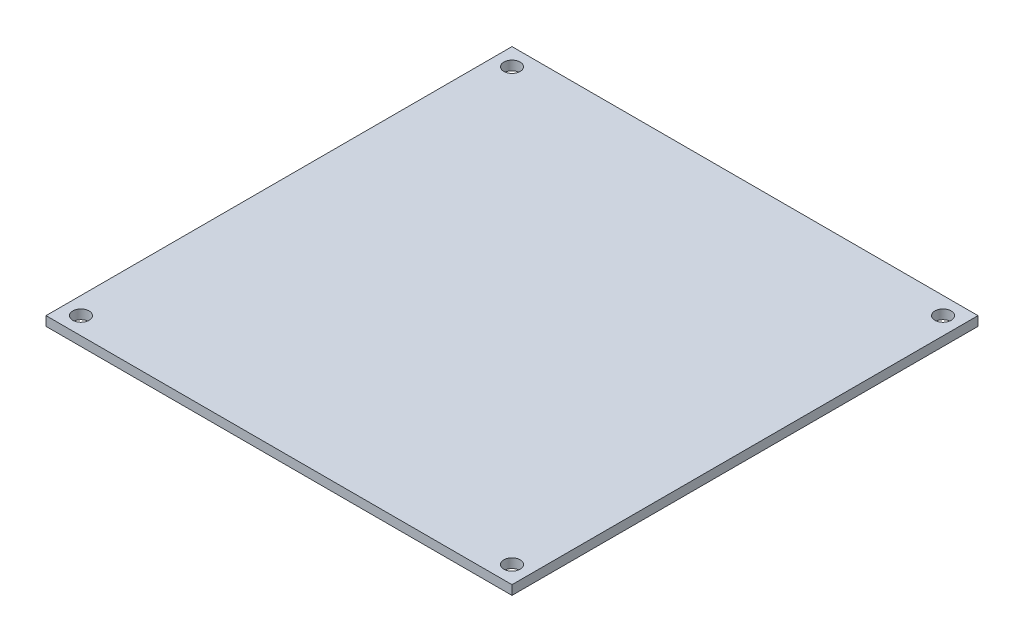
ISO-10303-21;
HEADER;
FILE_DESCRIPTION(('STEP AP214'),'2;1');
FILE_NAME('part.step','',(''),(''),'','','');
FILE_SCHEMA(('AUTOMOTIVE_DESIGN { 1 0 10303 214 1 1 1 1 }'));
ENDSEC;
DATA;
#1=APPLICATION_CONTEXT('core data for automotive mechanical design processes');
#2=APPLICATION_PROTOCOL_DEFINITION('international standard','automotive_design',2000,#1);
#3=PRODUCT_CONTEXT('',#1,'mechanical');
#4=PRODUCT('Part','Part','',(#3));
#5=PRODUCT_RELATED_PRODUCT_CATEGORY('part','',(#4));
#6=PRODUCT_DEFINITION_FORMATION('','',#4);
#7=PRODUCT_DEFINITION_CONTEXT('part definition',#1,'design');
#8=PRODUCT_DEFINITION('design','',#6,#7);
#9=PRODUCT_DEFINITION_SHAPE('','',#8);
#10=(LENGTH_UNIT() NAMED_UNIT(*) SI_UNIT(.MILLI.,.METRE.));
#11=(NAMED_UNIT(*) PLANE_ANGLE_UNIT() SI_UNIT($,.RADIAN.));
#12=(NAMED_UNIT(*) SI_UNIT($,.STERADIAN.) SOLID_ANGLE_UNIT());
#13=UNCERTAINTY_MEASURE_WITH_UNIT(LENGTH_MEASURE(1.E-05),#10,'distance_accuracy_value','');
#14=(GEOMETRIC_REPRESENTATION_CONTEXT(3) GLOBAL_UNCERTAINTY_ASSIGNED_CONTEXT((#13)) GLOBAL_UNIT_ASSIGNED_CONTEXT((#10,
#11,#12)) REPRESENTATION_CONTEXT('',''));
#15=CARTESIAN_POINT('',(0.,0.,0.));
#16=DIRECTION('',(0.,0.,1.));
#17=DIRECTION('',(1.,0.,0.));
#18=AXIS2_PLACEMENT_3D('',#15,#16,#17);
#19=CARTESIAN_POINT('',(0.,2.,0.));
#20=DIRECTION('',(0.,1.,0.));
#21=DIRECTION('',(0.,0.,1.));
#22=AXIS2_PLACEMENT_3D('',#19,#20,#21);
#23=PLANE('',#22);
#24=CARTESIAN_POINT('',(46.25,2.,46.25));
#25=DIRECTION('',(0.,1.,0.));
#26=DIRECTION('',(0.,0.,1.));
#27=AXIS2_PLACEMENT_3D('',#24,#25,#26);
#28=CIRCLE('',#27,1.75);
#29=CARTESIAN_POINT('',(46.25,2.,48.));
#30=VERTEX_POINT('',#29);
#31=EDGE_CURVE('E120',#30,#30,#28,.T.);
#32=ORIENTED_EDGE('',*,*,#31,.F.);
#33=EDGE_LOOP('',(#32));
#34=FACE_BOUND('',#33,.T.);
#35=CARTESIAN_POINT('',(-46.25,2.,-46.25));
#36=DIRECTION('',(0.,1.,0.));
#37=DIRECTION('',(0.,0.,1.));
#38=AXIS2_PLACEMENT_3D('',#35,#36,#37);
#39=CIRCLE('',#38,1.75);
#40=CARTESIAN_POINT('',(-46.25,2.,-44.5));
#41=VERTEX_POINT('',#40);
#42=EDGE_CURVE('E99',#41,#41,#39,.T.);
#43=ORIENTED_EDGE('',*,*,#42,.F.);
#44=EDGE_LOOP('',(#43));
#45=FACE_BOUND('',#44,.T.);
#46=DIRECTION('',(0.,0.,1.));
#47=VECTOR('',#46,1.);
#48=CARTESIAN_POINT('',(-50.,2.,50.));
#49=LINE('',#48,#47);
#50=CARTESIAN_POINT('',(-50.,2.,-50.));
#51=VERTEX_POINT('',#50);
#52=CARTESIAN_POINT('',(-50.,2.,50.));
#53=VERTEX_POINT('',#52);
#54=EDGE_CURVE('E84',#51,#53,#49,.T.);
#55=ORIENTED_EDGE('',*,*,#54,.T.);
#56=DIRECTION('',(1.,0.,0.));
#57=VECTOR('',#56,1.);
#58=CARTESIAN_POINT('',(50.,2.,50.));
#59=LINE('',#58,#57);
#60=CARTESIAN_POINT('',(50.,2.,50.));
#61=VERTEX_POINT('',#60);
#62=EDGE_CURVE('E79',#53,#61,#59,.T.);
#63=ORIENTED_EDGE('',*,*,#62,.T.);
#64=DIRECTION('',(0.,0.,-1.));
#65=VECTOR('',#64,1.);
#66=CARTESIAN_POINT('',(50.,2.,50.));
#67=LINE('',#66,#65);
#68=CARTESIAN_POINT('',(50.,2.,-50.));
#69=VERTEX_POINT('',#68);
#70=EDGE_CURVE('E82',#61,#69,#67,.T.);
#71=ORIENTED_EDGE('',*,*,#70,.T.);
#72=DIRECTION('',(-1.,0.,0.));
#73=VECTOR('',#72,1.);
#74=CARTESIAN_POINT('',(50.,2.,-50.));
#75=LINE('',#74,#73);
#76=EDGE_CURVE('E49',#69,#51,#75,.T.);
#77=ORIENTED_EDGE('',*,*,#76,.T.);
#78=EDGE_LOOP('',(#55,#63,#71,#77));
#79=FACE_BOUND('',#78,.T.);
#80=CARTESIAN_POINT('',(46.25,2.,-46.25));
#81=DIRECTION('',(0.,1.,0.));
#82=DIRECTION('',(0.,0.,-1.));
#83=AXIS2_PLACEMENT_3D('',#80,#81,#82);
#84=CIRCLE('',#83,1.75);
#85=CARTESIAN_POINT('',(46.25,2.,-48.));
#86=VERTEX_POINT('',#85);
#87=EDGE_CURVE('E114',#86,#86,#84,.T.);
#88=ORIENTED_EDGE('',*,*,#87,.F.);
#89=EDGE_LOOP('',(#88));
#90=FACE_BOUND('',#89,.T.);
#91=CARTESIAN_POINT('',(-46.25,2.,46.25));
#92=DIRECTION('',(0.,1.,0.));
#93=DIRECTION('',(0.,0.,-1.));
#94=AXIS2_PLACEMENT_3D('',#91,#92,#93);
#95=CIRCLE('',#94,1.75);
#96=CARTESIAN_POINT('',(-46.25,2.,44.5));
#97=VERTEX_POINT('',#96);
#98=EDGE_CURVE('E126',#97,#97,#95,.T.);
#99=ORIENTED_EDGE('',*,*,#98,.F.);
#100=EDGE_LOOP('',(#99));
#101=FACE_BOUND('',#100,.T.);
#102=ADVANCED_FACE('F32',(#34,#45,#79,#90,#101),#23,.T.);
#103=CARTESIAN_POINT('',(0.,0.,0.));
#104=DIRECTION('',(0.,1.,0.));
#105=DIRECTION('',(0.,0.,1.));
#106=AXIS2_PLACEMENT_3D('',#103,#104,#105);
#107=PLANE('',#106);
#108=DIRECTION('',(0.,0.,1.));
#109=VECTOR('',#108,1.);
#110=CARTESIAN_POINT('',(-50.,0.,50.));
#111=LINE('',#110,#109);
#112=CARTESIAN_POINT('',(-50.,0.,-50.));
#113=VERTEX_POINT('',#112);
#114=CARTESIAN_POINT('',(-50.,0.,50.));
#115=VERTEX_POINT('',#114);
#116=EDGE_CURVE('E96',#113,#115,#111,.T.);
#117=ORIENTED_EDGE('',*,*,#116,.F.);
#118=DIRECTION('',(-1.,0.,0.));
#119=VECTOR('',#118,1.);
#120=CARTESIAN_POINT('',(50.,0.,-50.));
#121=LINE('',#120,#119);
#122=CARTESIAN_POINT('',(50.,0.,-50.));
#123=VERTEX_POINT('',#122);
#124=EDGE_CURVE('E72',#123,#113,#121,.T.);
#125=ORIENTED_EDGE('',*,*,#124,.F.);
#126=DIRECTION('',(0.,0.,-1.));
#127=VECTOR('',#126,1.);
#128=CARTESIAN_POINT('',(50.,0.,50.));
#129=LINE('',#128,#127);
#130=CARTESIAN_POINT('',(50.,0.,50.));
#131=VERTEX_POINT('',#130);
#132=EDGE_CURVE('E66',#131,#123,#129,.T.);
#133=ORIENTED_EDGE('',*,*,#132,.F.);
#134=DIRECTION('',(1.,0.,0.));
#135=VECTOR('',#134,1.);
#136=CARTESIAN_POINT('',(50.,0.,50.));
#137=LINE('',#136,#135);
#138=EDGE_CURVE('E88',#115,#131,#137,.T.);
#139=ORIENTED_EDGE('',*,*,#138,.F.);
#140=EDGE_LOOP('',(#117,#125,#133,#139));
#141=FACE_BOUND('',#140,.T.);
#142=CARTESIAN_POINT('',(-46.25,0.,-46.25));
#143=DIRECTION('',(0.,1.,0.));
#144=DIRECTION('',(0.,0.,1.));
#145=AXIS2_PLACEMENT_3D('',#142,#143,#144);
#146=CIRCLE('',#145,1.75);
#147=CARTESIAN_POINT('',(-46.25,0.,-44.5));
#148=VERTEX_POINT('',#147);
#149=EDGE_CURVE('E111',#148,#148,#146,.T.);
#150=ORIENTED_EDGE('',*,*,#149,.T.);
#151=EDGE_LOOP('',(#150));
#152=FACE_BOUND('',#151,.T.);
#153=CARTESIAN_POINT('',(46.25,0.,-46.25));
#154=DIRECTION('',(0.,1.,0.));
#155=DIRECTION('',(0.,0.,-1.));
#156=AXIS2_PLACEMENT_3D('',#153,#154,#155);
#157=CIRCLE('',#156,1.75);
#158=CARTESIAN_POINT('',(46.25,0.,-48.));
#159=VERTEX_POINT('',#158);
#160=EDGE_CURVE('E117',#159,#159,#157,.T.);
#161=ORIENTED_EDGE('',*,*,#160,.T.);
#162=EDGE_LOOP('',(#161));
#163=FACE_BOUND('',#162,.T.);
#164=CARTESIAN_POINT('',(46.25,0.,46.25));
#165=DIRECTION('',(0.,1.,0.));
#166=DIRECTION('',(0.,0.,1.));
#167=AXIS2_PLACEMENT_3D('',#164,#165,#166);
#168=CIRCLE('',#167,1.75);
#169=CARTESIAN_POINT('',(46.25,0.,48.));
#170=VERTEX_POINT('',#169);
#171=EDGE_CURVE('E123',#170,#170,#168,.T.);
#172=ORIENTED_EDGE('',*,*,#171,.T.);
#173=EDGE_LOOP('',(#172));
#174=FACE_BOUND('',#173,.T.);
#175=CARTESIAN_POINT('',(-46.25,0.,46.25));
#176=DIRECTION('',(0.,1.,0.));
#177=DIRECTION('',(0.,0.,-1.));
#178=AXIS2_PLACEMENT_3D('',#175,#176,#177);
#179=CIRCLE('',#178,1.75);
#180=CARTESIAN_POINT('',(-46.25,0.,44.5));
#181=VERTEX_POINT('',#180);
#182=EDGE_CURVE('E129',#181,#181,#179,.T.);
#183=ORIENTED_EDGE('',*,*,#182,.T.);
#184=EDGE_LOOP('',(#183));
#185=FACE_BOUND('',#184,.T.);
#186=ADVANCED_FACE('F107',(#141,#152,#163,#174,#185),#107,.F.);
#187=CARTESIAN_POINT('',(-50.,2.,50.));
#188=DIRECTION('',(1.,0.,0.));
#189=DIRECTION('',(0.,0.,-1.));
#190=AXIS2_PLACEMENT_3D('',#187,#188,#189);
#191=PLANE('',#190);
#192=ORIENTED_EDGE('',*,*,#116,.T.);
#193=DIRECTION('',(0.,-1.,0.));
#194=VECTOR('',#193,1.);
#195=CARTESIAN_POINT('',(-50.,2.,50.));
#196=LINE('',#195,#194);
#197=EDGE_CURVE('E11',#53,#115,#196,.T.);
#198=ORIENTED_EDGE('',*,*,#197,.F.);
#199=ORIENTED_EDGE('',*,*,#54,.F.);
#200=DIRECTION('',(0.,-1.,0.));
#201=VECTOR('',#200,1.);
#202=CARTESIAN_POINT('',(-50.,2.,-50.));
#203=LINE('',#202,#201);
#204=EDGE_CURVE('E92',#51,#113,#203,.T.);
#205=ORIENTED_EDGE('',*,*,#204,.T.);
#206=EDGE_LOOP('',(#192,#198,#199,#205));
#207=FACE_BOUND('',#206,.T.);
#208=ADVANCED_FACE('F34',(#207),#191,.F.);
#209=CARTESIAN_POINT('',(50.,2.,50.));
#210=DIRECTION('',(0.,0.,-1.));
#211=DIRECTION('',(-1.,0.,0.));
#212=AXIS2_PLACEMENT_3D('',#209,#210,#211);
#213=PLANE('',#212);
#214=ORIENTED_EDGE('',*,*,#138,.T.);
#215=DIRECTION('',(0.,-1.,0.));
#216=VECTOR('',#215,1.);
#217=CARTESIAN_POINT('',(50.,2.,50.));
#218=LINE('',#217,#216);
#219=EDGE_CURVE('E41',#61,#131,#218,.T.);
#220=ORIENTED_EDGE('',*,*,#219,.F.);
#221=ORIENTED_EDGE('',*,*,#62,.F.);
#222=ORIENTED_EDGE('',*,*,#197,.T.);
#223=EDGE_LOOP('',(#214,#220,#221,#222));
#224=FACE_BOUND('',#223,.T.);
#225=ADVANCED_FACE('F87',(#224),#213,.F.);
#226=CARTESIAN_POINT('',(50.,2.,50.));
#227=DIRECTION('',(-1.,0.,0.));
#228=DIRECTION('',(0.,0.,1.));
#229=AXIS2_PLACEMENT_3D('',#226,#227,#228);
#230=PLANE('',#229);
#231=ORIENTED_EDGE('',*,*,#132,.T.);
#232=DIRECTION('',(0.,-1.,0.));
#233=VECTOR('',#232,1.);
#234=CARTESIAN_POINT('',(50.,2.,-50.));
#235=LINE('',#234,#233);
#236=EDGE_CURVE('E89',#69,#123,#235,.T.);
#237=ORIENTED_EDGE('',*,*,#236,.F.);
#238=ORIENTED_EDGE('',*,*,#70,.F.);
#239=ORIENTED_EDGE('',*,*,#219,.T.);
#240=EDGE_LOOP('',(#231,#237,#238,#239));
#241=FACE_BOUND('',#240,.T.);
#242=ADVANCED_FACE('F90',(#241),#230,.F.);
#243=CARTESIAN_POINT('',(50.,2.,-50.));
#244=DIRECTION('',(0.,0.,1.));
#245=DIRECTION('',(1.,0.,0.));
#246=AXIS2_PLACEMENT_3D('',#243,#244,#245);
#247=PLANE('',#246);
#248=ORIENTED_EDGE('',*,*,#124,.T.);
#249=ORIENTED_EDGE('',*,*,#204,.F.);
#250=ORIENTED_EDGE('',*,*,#76,.F.);
#251=ORIENTED_EDGE('',*,*,#236,.T.);
#252=EDGE_LOOP('',(#248,#249,#250,#251));
#253=FACE_BOUND('',#252,.T.);
#254=ADVANCED_FACE('F104',(#253),#247,.F.);
#255=CARTESIAN_POINT('',(-46.25,2.,-46.25));
#256=DIRECTION('',(0.,-1.,0.));
#257=DIRECTION('',(0.,0.,-1.));
#258=AXIS2_PLACEMENT_3D('',#255,#256,#257);
#259=CYLINDRICAL_SURFACE('',#258,1.75);
#260=ORIENTED_EDGE('',*,*,#42,.T.);
#261=EDGE_LOOP('',(#260));
#262=FACE_BOUND('',#261,.T.);
#263=ORIENTED_EDGE('',*,*,#149,.F.);
#264=EDGE_LOOP('',(#263));
#265=FACE_BOUND('',#264,.T.);
#266=ADVANCED_FACE('F148',(#262,#265),#259,.F.);
#267=CARTESIAN_POINT('',(46.25,2.,-46.25));
#268=DIRECTION('',(0.,-1.,0.));
#269=DIRECTION('',(0.,0.,-1.));
#270=AXIS2_PLACEMENT_3D('',#267,#268,#269);
#271=CYLINDRICAL_SURFACE('',#270,1.75);
#272=ORIENTED_EDGE('',*,*,#87,.T.);
#273=EDGE_LOOP('',(#272));
#274=FACE_BOUND('',#273,.T.);
#275=ORIENTED_EDGE('',*,*,#160,.F.);
#276=EDGE_LOOP('',(#275));
#277=FACE_BOUND('',#276,.T.);
#278=ADVANCED_FACE('F194',(#274,#277),#271,.F.);
#279=CARTESIAN_POINT('',(46.25,2.,46.25));
#280=DIRECTION('',(0.,-1.,0.));
#281=DIRECTION('',(0.,0.,-1.));
#282=AXIS2_PLACEMENT_3D('',#279,#280,#281);
#283=CYLINDRICAL_SURFACE('',#282,1.75);
#284=ORIENTED_EDGE('',*,*,#31,.T.);
#285=EDGE_LOOP('',(#284));
#286=FACE_BOUND('',#285,.T.);
#287=ORIENTED_EDGE('',*,*,#171,.F.);
#288=EDGE_LOOP('',(#287));
#289=FACE_BOUND('',#288,.T.);
#290=ADVANCED_FACE('F202',(#286,#289),#283,.F.);
#291=CARTESIAN_POINT('',(-46.25,2.,46.25));
#292=DIRECTION('',(0.,-1.,0.));
#293=DIRECTION('',(0.,0.,-1.));
#294=AXIS2_PLACEMENT_3D('',#291,#292,#293);
#295=CYLINDRICAL_SURFACE('',#294,1.75);
#296=ORIENTED_EDGE('',*,*,#98,.T.);
#297=EDGE_LOOP('',(#296));
#298=FACE_BOUND('',#297,.T.);
#299=ORIENTED_EDGE('',*,*,#182,.F.);
#300=EDGE_LOOP('',(#299));
#301=FACE_BOUND('',#300,.T.);
#302=ADVANCED_FACE('F135',(#298,#301),#295,.F.);
#303=CLOSED_SHELL('',(#102,#186,#208,#225,#242,#254,#266,#278,#290,#302));
#304=MANIFOLD_SOLID_BREP('B2',#303);
#305=ADVANCED_BREP_SHAPE_REPRESENTATION('',(#18,#304),#14);
#306=SHAPE_DEFINITION_REPRESENTATION(#9,#305);
ENDSEC;
END-ISO-10303-21;
